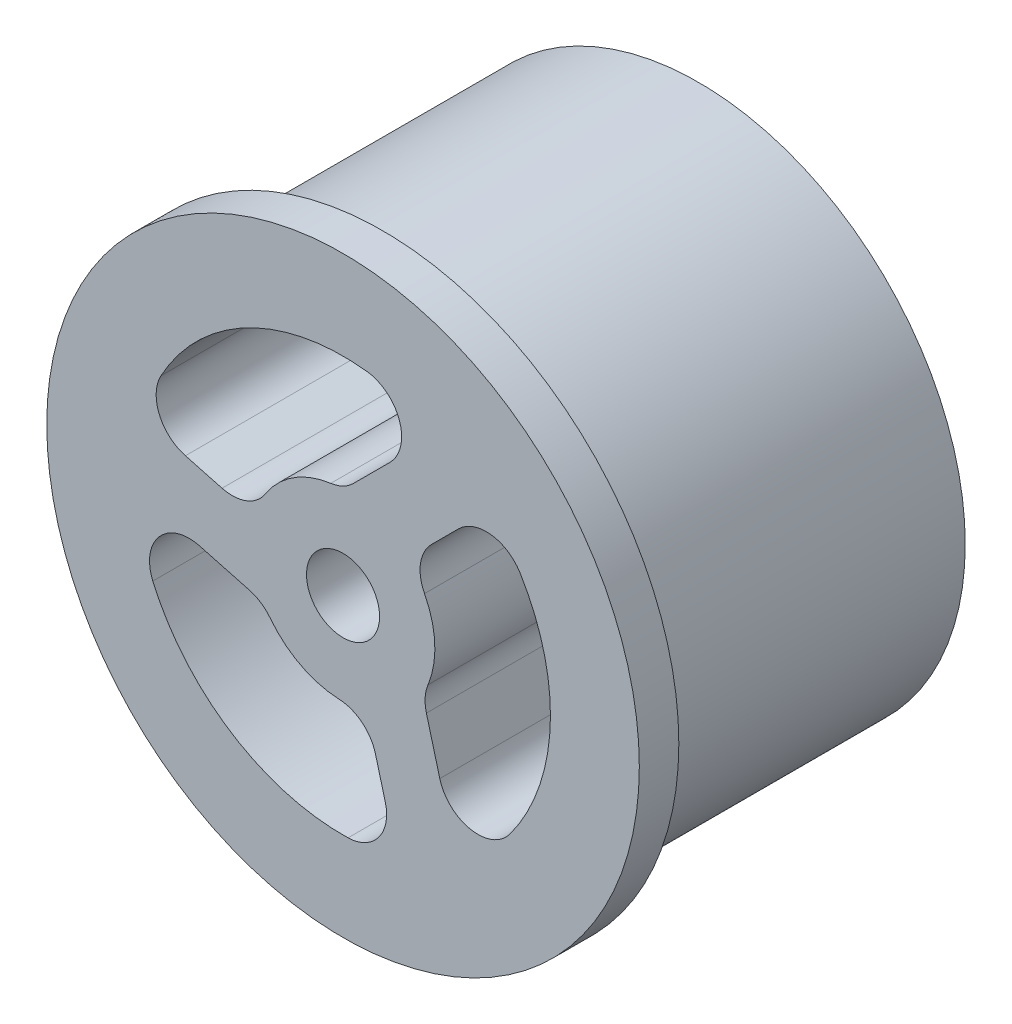
ISO-10303-21;
HEADER;
FILE_DESCRIPTION(('STEP AP214'),'2;1');
FILE_NAME('part.step','',(''),(''),'','','');
FILE_SCHEMA(('AUTOMOTIVE_DESIGN { 1 0 10303 214 1 1 1 1 }'));
ENDSEC;
DATA;
#1=APPLICATION_CONTEXT('core data for automotive mechanical design processes');
#2=APPLICATION_PROTOCOL_DEFINITION('international standard','automotive_design',2000,#1);
#3=PRODUCT_CONTEXT('',#1,'mechanical');
#4=PRODUCT('Part','Part','',(#3));
#5=PRODUCT_RELATED_PRODUCT_CATEGORY('part','',(#4));
#6=PRODUCT_DEFINITION_FORMATION('','',#4);
#7=PRODUCT_DEFINITION_CONTEXT('part definition',#1,'design');
#8=PRODUCT_DEFINITION('design','',#6,#7);
#9=PRODUCT_DEFINITION_SHAPE('','',#8);
#10=(LENGTH_UNIT() NAMED_UNIT(*) SI_UNIT(.MILLI.,.METRE.));
#11=(NAMED_UNIT(*) PLANE_ANGLE_UNIT() SI_UNIT($,.RADIAN.));
#12=(NAMED_UNIT(*) SI_UNIT($,.STERADIAN.) SOLID_ANGLE_UNIT());
#13=UNCERTAINTY_MEASURE_WITH_UNIT(LENGTH_MEASURE(1.E-05),#10,'distance_accuracy_value','');
#14=(GEOMETRIC_REPRESENTATION_CONTEXT(3) GLOBAL_UNCERTAINTY_ASSIGNED_CONTEXT((#13)) GLOBAL_UNIT_ASSIGNED_CONTEXT((#10,
#11,#12)) REPRESENTATION_CONTEXT('',''));
#15=CARTESIAN_POINT('',(0.,0.,0.));
#16=DIRECTION('',(0.,0.,1.));
#17=DIRECTION('',(1.,0.,0.));
#18=AXIS2_PLACEMENT_3D('',#15,#16,#17);
#19=CARTESIAN_POINT('',(0.,0.,9.));
#20=DIRECTION('',(0.,0.,-1.));
#21=DIRECTION('',(-1.,0.,0.));
#22=AXIS2_PLACEMENT_3D('',#19,#20,#21);
#23=CYLINDRICAL_SURFACE('',#22,6.75);
#24=CARTESIAN_POINT('',(0.,0.,0.));
#25=DIRECTION('',(0.,0.,1.));
#26=DIRECTION('',(1.,0.,0.));
#27=AXIS2_PLACEMENT_3D('',#24,#25,#26);
#28=CIRCLE('',#27,6.75);
#29=CARTESIAN_POINT('',(6.75,0.,0.));
#30=VERTEX_POINT('',#29);
#31=EDGE_CURVE('E235',#30,#30,#28,.T.);
#32=ORIENTED_EDGE('',*,*,#31,.T.);
#33=EDGE_LOOP('',(#32));
#34=FACE_BOUND('',#33,.T.);
#35=CARTESIAN_POINT('',(0.,0.,8.));
#36=DIRECTION('',(0.,0.,1.));
#37=DIRECTION('',(1.,0.,0.));
#38=AXIS2_PLACEMENT_3D('',#35,#36,#37);
#39=CIRCLE('',#38,6.75);
#40=CARTESIAN_POINT('',(6.75,0.,8.));
#41=VERTEX_POINT('',#40);
#42=EDGE_CURVE('E355',#41,#41,#39,.T.);
#43=ORIENTED_EDGE('',*,*,#42,.F.);
#44=EDGE_LOOP('',(#43));
#45=FACE_BOUND('',#44,.T.);
#46=ADVANCED_FACE('F47',(#34,#45),#23,.T.);
#47=CARTESIAN_POINT('',(0.,0.,9.));
#48=DIRECTION('',(0.,0.,-1.));
#49=DIRECTION('',(-1.,0.,0.));
#50=AXIS2_PLACEMENT_3D('',#47,#48,#49);
#51=CYLINDRICAL_SURFACE('',#50,5.25);
#52=CARTESIAN_POINT('',(0.,0.,0.));
#53=DIRECTION('',(0.,0.,1.));
#54=DIRECTION('',(1.,0.,0.));
#55=AXIS2_PLACEMENT_3D('',#52,#53,#54);
#56=CIRCLE('',#55,5.25);
#57=CARTESIAN_POINT('',(-4.81561186095118,-2.0910242477471,0.));
#58=VERTEX_POINT('',#57);
#59=CARTESIAN_POINT('',(0.127448118152494,-5.2484528174672,0.));
#60=VERTEX_POINT('',#59);
#61=EDGE_CURVE('E398',#58,#60,#56,.T.);
#62=ORIENTED_EDGE('',*,*,#61,.F.);
#63=DIRECTION('',(0.,0.,-1.));
#64=VECTOR('',#63,1.);
#65=CARTESIAN_POINT('',(-4.81561186095118,-2.0910242477471,9.));
#66=LINE('',#65,#64);
#67=CARTESIAN_POINT('',(-4.81561186095118,-2.0910242477471,9.));
#68=VERTEX_POINT('',#67);
#69=EDGE_CURVE('E366',#58,#68,#66,.F.);
#70=ORIENTED_EDGE('',*,*,#69,.T.);
#71=CARTESIAN_POINT('',(0.,0.,9.));
#72=DIRECTION('',(0.,0.,1.));
#73=DIRECTION('',(1.,0.,0.));
#74=AXIS2_PLACEMENT_3D('',#71,#72,#73);
#75=CIRCLE('',#74,5.25);
#76=CARTESIAN_POINT('',(0.127448118152494,-5.2484528174672,9.));
#77=VERTEX_POINT('',#76);
#78=EDGE_CURVE('E417',#68,#77,#75,.T.);
#79=ORIENTED_EDGE('',*,*,#78,.T.);
#80=DIRECTION('',(0.,0.,-1.));
#81=VECTOR('',#80,1.);
#82=CARTESIAN_POINT('',(0.127448118152494,-5.2484528174672,9.));
#83=LINE('',#82,#81);
#84=EDGE_CURVE('E295',#77,#60,#83,.T.);
#85=ORIENTED_EDGE('',*,*,#84,.T.);
#86=EDGE_LOOP('',(#62,#70,#79,#85));
#87=FACE_BOUND('',#86,.T.);
#88=ADVANCED_FACE('F405',(#87),#51,.F.);
#89=CARTESIAN_POINT('',(0.59692581199734,5.21595433022293,0.));
#90=VERTEX_POINT('',#89);
#91=CARTESIAN_POINT('',(-4.60901752956685,2.51385310074903,0.));
#92=VERTEX_POINT('',#91);
#93=EDGE_CURVE('E410',#90,#92,#56,.T.);
#94=ORIENTED_EDGE('',*,*,#93,.F.);
#95=DIRECTION('',(0.,0.,-1.));
#96=VECTOR('',#95,1.);
#97=CARTESIAN_POINT('',(0.59692581199734,5.21595433022293,9.));
#98=LINE('',#97,#96);
#99=CARTESIAN_POINT('',(0.59692581199734,5.21595433022293,9.));
#100=VERTEX_POINT('',#99);
#101=EDGE_CURVE('E359',#90,#100,#98,.F.);
#102=ORIENTED_EDGE('',*,*,#101,.T.);
#103=CARTESIAN_POINT('',(-4.60901752956685,2.51385310074903,9.));
#104=VERTEX_POINT('',#103);
#105=EDGE_CURVE('E242',#100,#104,#75,.T.);
#106=ORIENTED_EDGE('',*,*,#105,.T.);
#107=DIRECTION('',(0.,0.,-1.));
#108=VECTOR('',#107,1.);
#109=CARTESIAN_POINT('',(-4.60901752956685,2.51385310074903,9.));
#110=LINE('',#109,#108);
#111=EDGE_CURVE('E299',#104,#92,#110,.T.);
#112=ORIENTED_EDGE('',*,*,#111,.T.);
#113=EDGE_LOOP('',(#94,#102,#106,#112));
#114=FACE_BOUND('',#113,.T.);
#115=ADVANCED_FACE('F456',(#114),#51,.F.);
#116=CARTESIAN_POINT('',(4.21868604895386,-3.12493008247577,0.));
#117=VERTEX_POINT('',#116);
#118=CARTESIAN_POINT('',(4.48156941141436,2.73459971671818,0.));
#119=VERTEX_POINT('',#118);
#120=EDGE_CURVE('E411',#117,#119,#56,.T.);
#121=ORIENTED_EDGE('',*,*,#120,.F.);
#122=DIRECTION('',(0.,0.,-1.));
#123=VECTOR('',#122,1.);
#124=CARTESIAN_POINT('',(4.21868604895386,-3.12493008247577,9.));
#125=LINE('',#124,#123);
#126=CARTESIAN_POINT('',(4.21868604895386,-3.12493008247577,9.));
#127=VERTEX_POINT('',#126);
#128=EDGE_CURVE('E373',#117,#127,#125,.F.);
#129=ORIENTED_EDGE('',*,*,#128,.T.);
#130=CARTESIAN_POINT('',(4.48156941141436,2.73459971671818,9.));
#131=VERTEX_POINT('',#130);
#132=EDGE_CURVE('E435',#127,#131,#75,.T.);
#133=ORIENTED_EDGE('',*,*,#132,.T.);
#134=DIRECTION('',(0.,0.,-1.));
#135=VECTOR('',#134,1.);
#136=CARTESIAN_POINT('',(4.48156941141436,2.73459971671818,9.));
#137=LINE('',#136,#135);
#138=EDGE_CURVE('E291',#131,#119,#137,.T.);
#139=ORIENTED_EDGE('',*,*,#138,.T.);
#140=EDGE_LOOP('',(#121,#129,#133,#139));
#141=FACE_BOUND('',#140,.T.);
#142=ADVANCED_FACE('F552',(#141),#51,.F.);
#143=CARTESIAN_POINT('',(0.,0.,9.));
#144=DIRECTION('',(0.,0.,1.));
#145=DIRECTION('',(1.,0.,0.));
#146=AXIS2_PLACEMENT_3D('',#143,#144,#145);
#147=PLANE('',#146);
#148=ORIENTED_EDGE('',*,*,#105,.F.);
#149=CARTESIAN_POINT('',(0.48322565733118,4.22243921970428,9.));
#150=DIRECTION('',(0.,0.,1.));
#151=DIRECTION('',(1.,0.,0.));
#152=AXIS2_PLACEMENT_3D('',#149,#150,#151);
#153=CIRCLE('',#152,1.);
#154=CARTESIAN_POINT('',(1.19033243851773,3.51533243851773,9.));
#155=VERTEX_POINT('',#154);
#156=EDGE_CURVE('E379',#100,#155,#153,.F.);
#157=ORIENTED_EDGE('',*,*,#156,.T.);
#158=DIRECTION('',(0.707106781186548,0.707106781186547,0.));
#159=VECTOR('',#158,1.);
#160=CARTESIAN_POINT('',(-1.1625,1.1625,9.));
#161=LINE('',#160,#159);
#162=CARTESIAN_POINT('',(0.263116702953945,2.58811670295394,9.));
#163=VERTEX_POINT('',#162);
#164=EDGE_CURVE('E505',#163,#155,#161,.T.);
#165=ORIENTED_EDGE('',*,*,#164,.F.);
#166=CARTESIAN_POINT('',(-0.443990078232603,3.29522348414049,9.));
#167=DIRECTION('',(0.,0.,1.));
#168=DIRECTION('',(1.,0.,0.));
#169=AXIS2_PLACEMENT_3D('',#166,#167,#168);
#170=CIRCLE('',#169,1.);
#171=CARTESIAN_POINT('',(-0.310459227636331,2.30417882725613,9.));
#172=VERTEX_POINT('',#171);
#173=EDGE_CURVE('E309',#163,#172,#170,.F.);
#174=ORIENTED_EDGE('',*,*,#173,.T.);
#175=CARTESIAN_POINT('',(0.,0.,9.));
#176=DIRECTION('',(0.,0.,1.));
#177=DIRECTION('',(1.,0.,0.));
#178=AXIS2_PLACEMENT_3D('',#175,#176,#177);
#179=CIRCLE('',#178,2.325);
#180=CARTESIAN_POINT('',(-1.96082475084321,1.24931633163129,9.));
#181=VERTEX_POINT('',#180);
#182=EDGE_CURVE('E431',#172,#181,#179,.T.);
#183=ORIENTED_EDGE('',*,*,#182,.T.);
#184=CARTESIAN_POINT('',(-2.80419023507685,1.78665668932217,9.));
#185=DIRECTION('',(0.,0.,1.));
#186=DIRECTION('',(1.,0.,0.));
#187=AXIS2_PLACEMENT_3D('',#184,#185,#186);
#188=CIRCLE('',#187,1.);
#189=CARTESIAN_POINT('',(-3.06300928017937,0.820730863033104,9.));
#190=VERTEX_POINT('',#189);
#191=EDGE_CURVE('E315',#181,#190,#188,.F.);
#192=ORIENTED_EDGE('',*,*,#191,.T.);
#193=DIRECTION('',(-0.965925826289068,0.258819045102523,0.));
#194=VECTOR('',#193,1.);
#195=CARTESIAN_POINT('',(0.,0.,9.));
#196=LINE('',#195,#194);
#197=CARTESIAN_POINT('',(-3.9899284737995,1.06909811241253,9.));
#198=VERTEX_POINT('',#197);
#199=EDGE_CURVE('E423',#190,#198,#196,.T.);
#200=ORIENTED_EDGE('',*,*,#199,.T.);
#201=CARTESIAN_POINT('',(-3.73110942869697,2.03502393870159,9.));
#202=DIRECTION('',(0.,0.,1.));
#203=DIRECTION('',(1.,0.,0.));
#204=AXIS2_PLACEMENT_3D('',#201,#202,#203);
#205=CIRCLE('',#204,1.);
#206=EDGE_CURVE('E348',#198,#104,#205,.F.);
#207=ORIENTED_EDGE('',*,*,#206,.T.);
#208=EDGE_LOOP('',(#148,#157,#165,#174,#183,#192,#200,#207));
#209=FACE_BOUND('',#208,.T.);
#210=CARTESIAN_POINT('',(0.,0.,9.));
#211=DIRECTION('',(0.,0.,1.));
#212=DIRECTION('',(1.,0.,0.));
#213=AXIS2_PLACEMENT_3D('',#210,#211,#212);
#214=CIRCLE('',#213,2.325);
#215=CARTESIAN_POINT('',(2.15070701308423,-0.883223835655674,9.));
#216=VERTEX_POINT('',#215);
#217=CARTESIAN_POINT('',(2.06235205597709,1.07346588078387,9.));
#218=VERTEX_POINT('',#217);
#219=EDGE_CURVE('E211',#216,#218,#214,.T.);
#220=ORIENTED_EDGE('',*,*,#219,.T.);
#221=CARTESIAN_POINT('',(2.94938519833282,1.53517163595973,9.));
#222=DIRECTION('',(0.,0.,1.));
#223=DIRECTION('',(1.,0.,0.));
#224=AXIS2_PLACEMENT_3D('',#221,#222,#223);
#225=CIRCLE('',#224,1.);
#226=CARTESIAN_POINT('',(2.24227841714627,2.24227841714627,9.));
#227=VERTEX_POINT('',#226);
#228=EDGE_CURVE('E303',#218,#227,#225,.F.);
#229=ORIENTED_EDGE('',*,*,#228,.T.);
#230=DIRECTION('',(0.707106781186548,0.707106781186548,0.));
#231=VECTOR('',#230,1.);
#232=CARTESIAN_POINT('',(0.,0.,9.));
#233=LINE('',#232,#231);
#234=CARTESIAN_POINT('',(2.92083036138698,2.92083036138698,9.));
#235=VERTEX_POINT('',#234);
#236=EDGE_CURVE('E230',#227,#235,#233,.T.);
#237=ORIENTED_EDGE('',*,*,#236,.T.);
#238=CARTESIAN_POINT('',(3.62793714257353,2.21372358020043,9.));
#239=DIRECTION('',(0.,0.,1.));
#240=DIRECTION('',(1.,0.,0.));
#241=AXIS2_PLACEMENT_3D('',#238,#239,#240);
#242=CIRCLE('',#241,1.);
#243=EDGE_CURVE('E334',#235,#131,#242,.F.);
#244=ORIENTED_EDGE('',*,*,#243,.T.);
#245=ORIENTED_EDGE('',*,*,#132,.F.);
#246=CARTESIAN_POINT('',(3.41512680153408,-2.52970530486134,9.));
#247=DIRECTION('',(0.,0.,1.));
#248=DIRECTION('',(1.,0.,0.));
#249=AXIS2_PLACEMENT_3D('',#246,#247,#248);
#250=CIRCLE('',#249,1.);
#251=CARTESIAN_POINT('',(2.44920097524501,-2.78852434996386,9.));
#252=VERTEX_POINT('',#251);
#253=EDGE_CURVE('E56',#127,#252,#250,.F.);
#254=ORIENTED_EDGE('',*,*,#253,.T.);
#255=DIRECTION('',(0.258819045102521,-0.965925826289068,0.));
#256=VECTOR('',#255,1.);
#257=CARTESIAN_POINT('',(1.58800453189944,0.425504531899419,9.));
#258=LINE('',#257,#256);
#259=CARTESIAN_POINT('',(2.10981646123999,-1.52192410039504,9.));
#260=VERTEX_POINT('',#259);
#261=EDGE_CURVE('E212',#260,#252,#258,.T.);
#262=ORIENTED_EDGE('',*,*,#261,.F.);
#263=CARTESIAN_POINT('',(3.07574228752906,-1.26310505529252,9.));
#264=DIRECTION('',(0.,0.,1.));
#265=DIRECTION('',(1.,0.,0.));
#266=AXIS2_PLACEMENT_3D('',#263,#264,#265);
#267=CIRCLE('',#266,1.);
#268=EDGE_CURVE('E207',#260,#216,#267,.F.);
#269=ORIENTED_EDGE('',*,*,#268,.T.);
#270=EDGE_LOOP('',(#220,#229,#237,#244,#245,#254,#262,#269));
#271=FACE_BOUND('',#270,.T.);
#272=ORIENTED_EDGE('',*,*,#78,.F.);
#273=CARTESIAN_POINT('',(-3.89835245886524,-1.69273391484289,9.));
#274=DIRECTION('',(0.,0.,1.));
#275=DIRECTION('',(1.,0.,0.));
#276=AXIS2_PLACEMENT_3D('',#273,#274,#275);
#277=CIRCLE('',#276,1.);
#278=CARTESIAN_POINT('',(-3.63953341376272,-0.726808088553821,9.));
#279=VERTEX_POINT('',#278);
#280=EDGE_CURVE('E385',#68,#279,#277,.F.);
#281=ORIENTED_EDGE('',*,*,#280,.T.);
#282=DIRECTION('',(-0.965925826289068,0.258819045102521,0.));
#283=VECTOR('',#282,1.);
#284=CARTESIAN_POINT('',(-0.425504531899407,-1.5880045318994,9.));
#285=LINE('',#284,#283);
#286=CARTESIAN_POINT('',(-2.37293316419392,-1.06619260255884,9.));
#287=VERTEX_POINT('',#286);
#288=EDGE_CURVE('E416',#287,#279,#285,.T.);
#289=ORIENTED_EDGE('',*,*,#288,.F.);
#290=CARTESIAN_POINT('',(-2.63175220929645,-2.03211842884791,9.));
#291=DIRECTION('',(0.,0.,1.));
#292=DIRECTION('',(1.,0.,0.));
#293=AXIS2_PLACEMENT_3D('',#290,#291,#292);
#294=CIRCLE('',#293,1.);
#295=CARTESIAN_POINT('',(-1.84024778544789,-1.42095499160042,9.));
#296=VERTEX_POINT('',#295);
#297=EDGE_CURVE('E321',#287,#296,#294,.F.);
#298=ORIENTED_EDGE('',*,*,#297,.T.);
#299=CARTESIAN_POINT('',(0.,0.,9.));
#300=DIRECTION('',(0.,0.,1.));
#301=DIRECTION('',(1.,0.,0.));
#302=AXIS2_PLACEMENT_3D('',#299,#300,#301);
#303=CIRCLE('',#302,2.325);
#304=CARTESIAN_POINT('',(-0.101527305133866,-2.32278221241516,9.));
#305=VERTEX_POINT('',#304);
#306=EDGE_CURVE('E491',#296,#305,#303,.T.);
#307=ORIENTED_EDGE('',*,*,#306,.T.);
#308=CARTESIAN_POINT('',(-0.145194963255959,-3.32182832528189,9.));
#309=DIRECTION('',(0.,0.,1.));
#310=DIRECTION('',(1.,0.,0.));
#311=AXIS2_PLACEMENT_3D('',#308,#309,#310);
#312=CIRCLE('',#311,1.);
#313=CARTESIAN_POINT('',(0.820730863033112,-3.06300928017938,9.));
#314=VERTEX_POINT('',#313);
#315=EDGE_CURVE('E327',#305,#314,#312,.F.);
#316=ORIENTED_EDGE('',*,*,#315,.T.);
#317=DIRECTION('',(0.258819045102507,-0.965925826289072,0.));
#318=VECTOR('',#317,1.);
#319=CARTESIAN_POINT('',(0.,0.,9.));
#320=LINE('',#319,#318);
#321=CARTESIAN_POINT('',(1.06909811241252,-3.98992847379951,9.));
#322=VERTEX_POINT('',#321);
#323=EDGE_CURVE('E495',#314,#322,#320,.T.);
#324=ORIENTED_EDGE('',*,*,#323,.T.);
#325=CARTESIAN_POINT('',(0.103172286123447,-4.24874751890202,9.));
#326=DIRECTION('',(0.,0.,1.));
#327=DIRECTION('',(1.,0.,0.));
#328=AXIS2_PLACEMENT_3D('',#325,#326,#327);
#329=CIRCLE('',#328,1.);
#330=EDGE_CURVE('E341',#322,#77,#329,.F.);
#331=ORIENTED_EDGE('',*,*,#330,.T.);
#332=EDGE_LOOP('',(#272,#281,#289,#298,#307,#316,#324,#331));
#333=FACE_BOUND('',#332,.T.);
#334=CARTESIAN_POINT('',(0.,0.,9.));
#335=DIRECTION('',(0.,0.,1.));
#336=DIRECTION('',(1.,0.,0.));
#337=AXIS2_PLACEMENT_3D('',#334,#335,#336);
#338=CIRCLE('',#337,0.925);
#339=CARTESIAN_POINT('',(0.925,0.,9.));
#340=VERTEX_POINT('',#339);
#341=EDGE_CURVE('E422',#340,#340,#338,.T.);
#342=ORIENTED_EDGE('',*,*,#341,.F.);
#343=EDGE_LOOP('',(#342));
#344=FACE_BOUND('',#343,.T.);
#345=CARTESIAN_POINT('',(0.,0.,9.));
#346=DIRECTION('',(0.,0.,1.));
#347=DIRECTION('',(1.,0.,0.));
#348=AXIS2_PLACEMENT_3D('',#345,#346,#347);
#349=CIRCLE('',#348,7.5);
#350=CARTESIAN_POINT('',(7.5,0.,9.));
#351=VERTEX_POINT('',#350);
#352=EDGE_CURVE('E512',#351,#351,#349,.T.);
#353=ORIENTED_EDGE('',*,*,#352,.T.);
#354=EDGE_LOOP('',(#353));
#355=FACE_BOUND('',#354,.T.);
#356=ADVANCED_FACE('F209',(#209,#271,#333,#344,#355),#147,.T.);
#357=CARTESIAN_POINT('',(0.,0.,0.));
#358=DIRECTION('',(0.,0.,1.));
#359=DIRECTION('',(1.,0.,0.));
#360=AXIS2_PLACEMENT_3D('',#357,#358,#359);
#361=PLANE('',#360);
#362=CARTESIAN_POINT('',(0.,0.,0.));
#363=DIRECTION('',(0.,0.,1.));
#364=DIRECTION('',(1.,0.,0.));
#365=AXIS2_PLACEMENT_3D('',#362,#363,#364);
#366=CIRCLE('',#365,2.325);
#367=CARTESIAN_POINT('',(-0.310459227636331,2.30417882725613,0.));
#368=VERTEX_POINT('',#367);
#369=CARTESIAN_POINT('',(-1.96082475084321,1.24931633163129,0.));
#370=VERTEX_POINT('',#369);
#371=EDGE_CURVE('E477',#368,#370,#366,.T.);
#372=ORIENTED_EDGE('',*,*,#371,.F.);
#373=CARTESIAN_POINT('',(-0.443990078232603,3.29522348414049,0.));
#374=DIRECTION('',(0.,0.,1.));
#375=DIRECTION('',(1.,0.,0.));
#376=AXIS2_PLACEMENT_3D('',#373,#374,#375);
#377=CIRCLE('',#376,1.);
#378=CARTESIAN_POINT('',(0.263116702953945,2.58811670295394,0.));
#379=VERTEX_POINT('',#378);
#380=EDGE_CURVE('E312',#368,#379,#377,.T.);
#381=ORIENTED_EDGE('',*,*,#380,.T.);
#382=DIRECTION('',(0.707106781186548,0.707106781186547,0.));
#383=VECTOR('',#382,1.);
#384=CARTESIAN_POINT('',(-1.1625,1.1625,0.));
#385=LINE('',#384,#383);
#386=CARTESIAN_POINT('',(1.19033243851773,3.51533243851773,0.));
#387=VERTEX_POINT('',#386);
#388=EDGE_CURVE('E480',#379,#387,#385,.T.);
#389=ORIENTED_EDGE('',*,*,#388,.T.);
#390=CARTESIAN_POINT('',(0.48322565733118,4.22243921970428,0.));
#391=DIRECTION('',(0.,0.,1.));
#392=DIRECTION('',(1.,0.,0.));
#393=AXIS2_PLACEMENT_3D('',#390,#391,#392);
#394=CIRCLE('',#393,1.);
#395=EDGE_CURVE('E382',#387,#90,#394,.T.);
#396=ORIENTED_EDGE('',*,*,#395,.T.);
#397=ORIENTED_EDGE('',*,*,#93,.T.);
#398=CARTESIAN_POINT('',(-3.73110942869697,2.03502393870159,0.));
#399=DIRECTION('',(0.,0.,1.));
#400=DIRECTION('',(1.,0.,0.));
#401=AXIS2_PLACEMENT_3D('',#398,#399,#400);
#402=CIRCLE('',#401,1.);
#403=CARTESIAN_POINT('',(-3.9899284737995,1.06909811241253,0.));
#404=VERTEX_POINT('',#403);
#405=EDGE_CURVE('E352',#92,#404,#402,.T.);
#406=ORIENTED_EDGE('',*,*,#405,.T.);
#407=DIRECTION('',(-0.965925826289068,0.258819045102523,0.));
#408=VECTOR('',#407,1.);
#409=CARTESIAN_POINT('',(0.,0.,0.));
#410=LINE('',#409,#408);
#411=CARTESIAN_POINT('',(-3.06300928017937,0.820730863033104,0.));
#412=VERTEX_POINT('',#411);
#413=EDGE_CURVE('E465',#412,#404,#410,.T.);
#414=ORIENTED_EDGE('',*,*,#413,.F.);
#415=CARTESIAN_POINT('',(-2.80419023507685,1.78665668932217,0.));
#416=DIRECTION('',(0.,0.,1.));
#417=DIRECTION('',(1.,0.,0.));
#418=AXIS2_PLACEMENT_3D('',#415,#416,#417);
#419=CIRCLE('',#418,1.);
#420=EDGE_CURVE('E318',#412,#370,#419,.T.);
#421=ORIENTED_EDGE('',*,*,#420,.T.);
#422=EDGE_LOOP('',(#372,#381,#389,#396,#397,#406,#414,#421));
#423=FACE_BOUND('',#422,.T.);
#424=DIRECTION('',(0.258819045102521,-0.965925826289068,0.));
#425=VECTOR('',#424,1.);
#426=CARTESIAN_POINT('',(1.58800453189944,0.425504531899419,0.));
#427=LINE('',#426,#425);
#428=CARTESIAN_POINT('',(2.10981646123999,-1.52192410039504,0.));
#429=VERTEX_POINT('',#428);
#430=CARTESIAN_POINT('',(2.44920097524501,-2.78852434996386,0.));
#431=VERTEX_POINT('',#430);
#432=EDGE_CURVE('E526',#429,#431,#427,.T.);
#433=ORIENTED_EDGE('',*,*,#432,.T.);
#434=CARTESIAN_POINT('',(3.41512680153408,-2.52970530486134,0.));
#435=DIRECTION('',(0.,0.,1.));
#436=DIRECTION('',(1.,0.,0.));
#437=AXIS2_PLACEMENT_3D('',#434,#435,#436);
#438=CIRCLE('',#437,1.);
#439=EDGE_CURVE('E11',#431,#117,#438,.T.);
#440=ORIENTED_EDGE('',*,*,#439,.T.);
#441=ORIENTED_EDGE('',*,*,#120,.T.);
#442=CARTESIAN_POINT('',(3.62793714257353,2.21372358020043,0.));
#443=DIRECTION('',(0.,0.,1.));
#444=DIRECTION('',(1.,0.,0.));
#445=AXIS2_PLACEMENT_3D('',#442,#443,#444);
#446=CIRCLE('',#445,1.);
#447=CARTESIAN_POINT('',(2.92083036138698,2.92083036138698,0.));
#448=VERTEX_POINT('',#447);
#449=EDGE_CURVE('E338',#119,#448,#446,.T.);
#450=ORIENTED_EDGE('',*,*,#449,.T.);
#451=DIRECTION('',(0.707106781186548,0.707106781186548,0.));
#452=VECTOR('',#451,1.);
#453=CARTESIAN_POINT('',(0.,0.,0.));
#454=LINE('',#453,#452);
#455=CARTESIAN_POINT('',(2.24227841714627,2.24227841714627,0.));
#456=VERTEX_POINT('',#455);
#457=EDGE_CURVE('E485',#456,#448,#454,.T.);
#458=ORIENTED_EDGE('',*,*,#457,.F.);
#459=CARTESIAN_POINT('',(2.94938519833282,1.53517163595973,0.));
#460=DIRECTION('',(0.,0.,1.));
#461=DIRECTION('',(1.,0.,0.));
#462=AXIS2_PLACEMENT_3D('',#459,#460,#461);
#463=CIRCLE('',#462,1.);
#464=CARTESIAN_POINT('',(2.06235205597709,1.07346588078387,0.));
#465=VERTEX_POINT('',#464);
#466=EDGE_CURVE('E306',#456,#465,#463,.T.);
#467=ORIENTED_EDGE('',*,*,#466,.T.);
#468=CARTESIAN_POINT('',(0.,0.,0.));
#469=DIRECTION('',(0.,0.,1.));
#470=DIRECTION('',(1.,0.,0.));
#471=AXIS2_PLACEMENT_3D('',#468,#469,#470);
#472=CIRCLE('',#471,2.325);
#473=CARTESIAN_POINT('',(2.15070701308423,-0.883223835655674,0.));
#474=VERTEX_POINT('',#473);
#475=EDGE_CURVE('E529',#474,#465,#472,.T.);
#476=ORIENTED_EDGE('',*,*,#475,.F.);
#477=CARTESIAN_POINT('',(3.07574228752906,-1.26310505529252,0.));
#478=DIRECTION('',(0.,0.,1.));
#479=DIRECTION('',(1.,0.,0.));
#480=AXIS2_PLACEMENT_3D('',#477,#478,#479);
#481=CIRCLE('',#480,1.);
#482=EDGE_CURVE('E218',#474,#429,#481,.T.);
#483=ORIENTED_EDGE('',*,*,#482,.T.);
#484=EDGE_LOOP('',(#433,#440,#441,#450,#458,#467,#476,#483));
#485=FACE_BOUND('',#484,.T.);
#486=ORIENTED_EDGE('',*,*,#31,.F.);
#487=EDGE_LOOP('',(#486));
#488=FACE_BOUND('',#487,.T.);
#489=CARTESIAN_POINT('',(0.,0.,0.));
#490=DIRECTION('',(0.,0.,1.));
#491=DIRECTION('',(1.,0.,0.));
#492=AXIS2_PLACEMENT_3D('',#489,#490,#491);
#493=CIRCLE('',#492,2.325);
#494=CARTESIAN_POINT('',(-1.84024778544789,-1.42095499160042,0.));
#495=VERTEX_POINT('',#494);
#496=CARTESIAN_POINT('',(-0.101527305133866,-2.32278221241516,0.));
#497=VERTEX_POINT('',#496);
#498=EDGE_CURVE('E428',#495,#497,#493,.T.);
#499=ORIENTED_EDGE('',*,*,#498,.F.);
#500=CARTESIAN_POINT('',(-2.63175220929645,-2.03211842884791,0.));
#501=DIRECTION('',(0.,0.,1.));
#502=DIRECTION('',(1.,0.,0.));
#503=AXIS2_PLACEMENT_3D('',#500,#501,#502);
#504=CIRCLE('',#503,1.);
#505=CARTESIAN_POINT('',(-2.37293316419392,-1.06619260255884,0.));
#506=VERTEX_POINT('',#505);
#507=EDGE_CURVE('E324',#495,#506,#504,.T.);
#508=ORIENTED_EDGE('',*,*,#507,.T.);
#509=DIRECTION('',(-0.965925826289068,0.258819045102521,0.));
#510=VECTOR('',#509,1.);
#511=CARTESIAN_POINT('',(-0.425504531899407,-1.5880045318994,0.));
#512=LINE('',#511,#510);
#513=CARTESIAN_POINT('',(-3.63953341376272,-0.726808088553821,0.));
#514=VERTEX_POINT('',#513);
#515=EDGE_CURVE('E400',#506,#514,#512,.T.);
#516=ORIENTED_EDGE('',*,*,#515,.T.);
#517=CARTESIAN_POINT('',(-3.89835245886524,-1.69273391484289,0.));
#518=DIRECTION('',(0.,0.,1.));
#519=DIRECTION('',(1.,0.,0.));
#520=AXIS2_PLACEMENT_3D('',#517,#518,#519);
#521=CIRCLE('',#520,1.);
#522=EDGE_CURVE('E388',#514,#58,#521,.T.);
#523=ORIENTED_EDGE('',*,*,#522,.T.);
#524=ORIENTED_EDGE('',*,*,#61,.T.);
#525=CARTESIAN_POINT('',(0.103172286123447,-4.24874751890202,0.));
#526=DIRECTION('',(0.,0.,1.));
#527=DIRECTION('',(1.,0.,0.));
#528=AXIS2_PLACEMENT_3D('',#525,#526,#527);
#529=CIRCLE('',#528,1.);
#530=CARTESIAN_POINT('',(1.06909811241252,-3.98992847379951,0.));
#531=VERTEX_POINT('',#530);
#532=EDGE_CURVE('E345',#60,#531,#529,.T.);
#533=ORIENTED_EDGE('',*,*,#532,.T.);
#534=DIRECTION('',(0.258819045102507,-0.965925826289072,0.));
#535=VECTOR('',#534,1.);
#536=CARTESIAN_POINT('',(0.,0.,0.));
#537=LINE('',#536,#535);
#538=CARTESIAN_POINT('',(0.820730863033112,-3.06300928017938,0.));
#539=VERTEX_POINT('',#538);
#540=EDGE_CURVE('E522',#539,#531,#537,.T.);
#541=ORIENTED_EDGE('',*,*,#540,.F.);
#542=CARTESIAN_POINT('',(-0.145194963255959,-3.32182832528189,0.));
#543=DIRECTION('',(0.,0.,1.));
#544=DIRECTION('',(1.,0.,0.));
#545=AXIS2_PLACEMENT_3D('',#542,#543,#544);
#546=CIRCLE('',#545,1.);
#547=EDGE_CURVE('E219',#539,#497,#546,.T.);
#548=ORIENTED_EDGE('',*,*,#547,.T.);
#549=EDGE_LOOP('',(#499,#508,#516,#523,#524,#533,#541,#548));
#550=FACE_BOUND('',#549,.T.);
#551=CARTESIAN_POINT('',(0.,0.,0.));
#552=DIRECTION('',(0.,0.,1.));
#553=DIRECTION('',(1.,0.,0.));
#554=AXIS2_PLACEMENT_3D('',#551,#552,#553);
#555=CIRCLE('',#554,0.925);
#556=CARTESIAN_POINT('',(0.925,0.,0.));
#557=VERTEX_POINT('',#556);
#558=EDGE_CURVE('E438',#557,#557,#555,.T.);
#559=ORIENTED_EDGE('',*,*,#558,.T.);
#560=EDGE_LOOP('',(#559));
#561=FACE_BOUND('',#560,.T.);
#562=ADVANCED_FACE('F396',(#423,#485,#488,#550,#561),#361,.F.);
#563=CARTESIAN_POINT('',(0.,0.,0.));
#564=DIRECTION('',(0.,0.,1.));
#565=DIRECTION('',(1.,0.,0.));
#566=AXIS2_PLACEMENT_3D('',#563,#564,#565);
#567=CYLINDRICAL_SURFACE('',#566,2.325);
#568=ORIENTED_EDGE('',*,*,#306,.F.);
#569=DIRECTION('',(0.,0.,1.));
#570=VECTOR('',#569,1.);
#571=CARTESIAN_POINT('',(-1.84024778544789,-1.42095499160042,0.));
#572=LINE('',#571,#570);
#573=EDGE_CURVE('E278',#296,#495,#572,.F.);
#574=ORIENTED_EDGE('',*,*,#573,.T.);
#575=ORIENTED_EDGE('',*,*,#498,.T.);
#576=DIRECTION('',(0.,0.,1.));
#577=VECTOR('',#576,1.);
#578=CARTESIAN_POINT('',(-0.101527305133866,-2.32278221241516,0.));
#579=LINE('',#578,#577);
#580=EDGE_CURVE('E274',#497,#305,#579,.T.);
#581=ORIENTED_EDGE('',*,*,#580,.T.);
#582=EDGE_LOOP('',(#568,#574,#575,#581));
#583=FACE_BOUND('',#582,.T.);
#584=ADVANCED_FACE('F784',(#583),#567,.T.);
#585=CARTESIAN_POINT('',(-0.425504531899407,-1.5880045318994,0.));
#586=DIRECTION('',(0.258819045102521,0.965925826289068,0.));
#587=DIRECTION('',(-0.965925826289068,0.258819045102521,0.));
#588=AXIS2_PLACEMENT_3D('',#585,#586,#587);
#589=PLANE('',#588);
#590=ORIENTED_EDGE('',*,*,#288,.T.);
#591=DIRECTION('',(0.,0.,-1.));
#592=VECTOR('',#591,1.);
#593=CARTESIAN_POINT('',(-3.63953341376272,-0.726808088553821,0.));
#594=LINE('',#593,#592);
#595=EDGE_CURVE('E370',#279,#514,#594,.T.);
#596=ORIENTED_EDGE('',*,*,#595,.T.);
#597=ORIENTED_EDGE('',*,*,#515,.F.);
#598=DIRECTION('',(0.,0.,1.));
#599=VECTOR('',#598,1.);
#600=CARTESIAN_POINT('',(-2.37293316419392,-1.06619260255884,0.));
#601=LINE('',#600,#599);
#602=EDGE_CURVE('E270',#506,#287,#601,.T.);
#603=ORIENTED_EDGE('',*,*,#602,.T.);
#604=EDGE_LOOP('',(#590,#596,#597,#603));
#605=FACE_BOUND('',#604,.T.);
#606=ADVANCED_FACE('F419',(#605),#589,.F.);
#607=CARTESIAN_POINT('',(0.,0.,0.));
#608=DIRECTION('',(0.258819045102523,0.965925826289068,0.));
#609=DIRECTION('',(-0.965925826289068,0.258819045102523,0.));
#610=AXIS2_PLACEMENT_3D('',#607,#608,#609);
#611=PLANE('',#610);
#612=ORIENTED_EDGE('',*,*,#199,.F.);
#613=DIRECTION('',(0.,0.,-1.));
#614=VECTOR('',#613,1.);
#615=CARTESIAN_POINT('',(-3.06300928017937,0.820730863033104,0.));
#616=LINE('',#615,#614);
#617=EDGE_CURVE('E267',#190,#412,#616,.T.);
#618=ORIENTED_EDGE('',*,*,#617,.T.);
#619=ORIENTED_EDGE('',*,*,#413,.T.);
#620=DIRECTION('',(0.,0.,1.));
#621=VECTOR('',#620,1.);
#622=CARTESIAN_POINT('',(-3.9899284737995,1.06909811241253,9.));
#623=LINE('',#622,#621);
#624=EDGE_CURVE('E263',#404,#198,#623,.T.);
#625=ORIENTED_EDGE('',*,*,#624,.T.);
#626=EDGE_LOOP('',(#612,#618,#619,#625));
#627=FACE_BOUND('',#626,.T.);
#628=ADVANCED_FACE('F463',(#627),#611,.T.);
#629=CARTESIAN_POINT('',(0.,0.,0.));
#630=DIRECTION('',(0.,0.,1.));
#631=DIRECTION('',(1.,0.,0.));
#632=AXIS2_PLACEMENT_3D('',#629,#630,#631);
#633=CYLINDRICAL_SURFACE('',#632,2.325);
#634=ORIENTED_EDGE('',*,*,#182,.F.);
#635=DIRECTION('',(0.,0.,1.));
#636=VECTOR('',#635,1.);
#637=CARTESIAN_POINT('',(-0.310459227636331,2.30417882725613,0.));
#638=LINE('',#637,#636);
#639=EDGE_CURVE('E260',#172,#368,#638,.F.);
#640=ORIENTED_EDGE('',*,*,#639,.T.);
#641=ORIENTED_EDGE('',*,*,#371,.T.);
#642=DIRECTION('',(0.,0.,1.));
#643=VECTOR('',#642,1.);
#644=CARTESIAN_POINT('',(-1.96082475084321,1.24931633163129,0.));
#645=LINE('',#644,#643);
#646=EDGE_CURVE('E256',#370,#181,#645,.T.);
#647=ORIENTED_EDGE('',*,*,#646,.T.);
#648=EDGE_LOOP('',(#634,#640,#641,#647));
#649=FACE_BOUND('',#648,.T.);
#650=ADVANCED_FACE('F475',(#649),#633,.T.);
#651=CARTESIAN_POINT('',(-1.1625,1.1625,0.));
#652=DIRECTION('',(0.707106781186547,-0.707106781186548,0.));
#653=DIRECTION('',(0.707106781186548,0.707106781186547,0.));
#654=AXIS2_PLACEMENT_3D('',#651,#652,#653);
#655=PLANE('',#654);
#656=ORIENTED_EDGE('',*,*,#164,.T.);
#657=DIRECTION('',(0.,0.,-1.));
#658=VECTOR('',#657,1.);
#659=CARTESIAN_POINT('',(1.19033243851773,3.51533243851773,0.));
#660=LINE('',#659,#658);
#661=EDGE_CURVE('E363',#155,#387,#660,.T.);
#662=ORIENTED_EDGE('',*,*,#661,.T.);
#663=ORIENTED_EDGE('',*,*,#388,.F.);
#664=DIRECTION('',(0.,0.,1.));
#665=VECTOR('',#664,1.);
#666=CARTESIAN_POINT('',(0.263116702953945,2.58811670295394,0.));
#667=LINE('',#666,#665);
#668=EDGE_CURVE('E252',#379,#163,#667,.T.);
#669=ORIENTED_EDGE('',*,*,#668,.T.);
#670=EDGE_LOOP('',(#656,#662,#663,#669));
#671=FACE_BOUND('',#670,.T.);
#672=ADVANCED_FACE('F751',(#671),#655,.F.);
#673=CARTESIAN_POINT('',(0.,0.,0.));
#674=DIRECTION('',(0.707106781186547,-0.707106781186547,0.));
#675=DIRECTION('',(0.707106781186548,0.707106781186548,0.));
#676=AXIS2_PLACEMENT_3D('',#673,#674,#675);
#677=PLANE('',#676);
#678=ORIENTED_EDGE('',*,*,#236,.F.);
#679=DIRECTION('',(0.,0.,-1.));
#680=VECTOR('',#679,1.);
#681=CARTESIAN_POINT('',(2.24227841714627,2.24227841714627,0.));
#682=LINE('',#681,#680);
#683=EDGE_CURVE('E249',#227,#456,#682,.T.);
#684=ORIENTED_EDGE('',*,*,#683,.T.);
#685=ORIENTED_EDGE('',*,*,#457,.T.);
#686=DIRECTION('',(0.,0.,1.));
#687=VECTOR('',#686,1.);
#688=CARTESIAN_POINT('',(2.92083036138698,2.92083036138698,9.));
#689=LINE('',#688,#687);
#690=EDGE_CURVE('E239',#448,#235,#689,.T.);
#691=ORIENTED_EDGE('',*,*,#690,.T.);
#692=EDGE_LOOP('',(#678,#684,#685,#691));
#693=FACE_BOUND('',#692,.T.);
#694=ADVANCED_FACE('F537',(#693),#677,.T.);
#695=CARTESIAN_POINT('',(0.,0.,0.));
#696=DIRECTION('',(0.,0.,1.));
#697=DIRECTION('',(1.,0.,0.));
#698=AXIS2_PLACEMENT_3D('',#695,#696,#697);
#699=CYLINDRICAL_SURFACE('',#698,2.325);
#700=ORIENTED_EDGE('',*,*,#475,.T.);
#701=DIRECTION('',(0.,0.,1.));
#702=VECTOR('',#701,1.);
#703=CARTESIAN_POINT('',(2.06235205597709,1.07346588078387,0.));
#704=LINE('',#703,#702);
#705=EDGE_CURVE('E228',#465,#218,#704,.T.);
#706=ORIENTED_EDGE('',*,*,#705,.T.);
#707=ORIENTED_EDGE('',*,*,#219,.F.);
#708=DIRECTION('',(0.,0.,1.));
#709=VECTOR('',#708,1.);
#710=CARTESIAN_POINT('',(2.15070701308423,-0.883223835655673,0.));
#711=LINE('',#710,#709);
#712=EDGE_CURVE('E225',#216,#474,#711,.F.);
#713=ORIENTED_EDGE('',*,*,#712,.T.);
#714=EDGE_LOOP('',(#700,#706,#707,#713));
#715=FACE_BOUND('',#714,.T.);
#716=ADVANCED_FACE('F224',(#715),#699,.T.);
#717=CARTESIAN_POINT('',(1.58800453189944,0.425504531899419,0.));
#718=DIRECTION('',(-0.965925826289068,-0.258819045102521,0.));
#719=DIRECTION('',(0.258819045102521,-0.965925826289068,0.));
#720=AXIS2_PLACEMENT_3D('',#717,#718,#719);
#721=PLANE('',#720);
#722=ORIENTED_EDGE('',*,*,#261,.T.);
#723=DIRECTION('',(0.,0.,-1.));
#724=VECTOR('',#723,1.);
#725=CARTESIAN_POINT('',(2.44920097524501,-2.78852434996386,0.));
#726=LINE('',#725,#724);
#727=EDGE_CURVE('E69',#252,#431,#726,.T.);
#728=ORIENTED_EDGE('',*,*,#727,.T.);
#729=ORIENTED_EDGE('',*,*,#432,.F.);
#730=DIRECTION('',(0.,0.,1.));
#731=VECTOR('',#730,1.);
#732=CARTESIAN_POINT('',(2.10981646123999,-1.52192410039504,0.));
#733=LINE('',#732,#731);
#734=EDGE_CURVE('E288',#429,#260,#733,.T.);
#735=ORIENTED_EDGE('',*,*,#734,.T.);
#736=EDGE_LOOP('',(#722,#728,#729,#735));
#737=FACE_BOUND('',#736,.T.);
#738=ADVANCED_FACE('F548',(#737),#721,.F.);
#739=CARTESIAN_POINT('',(0.,0.,0.));
#740=DIRECTION('',(-0.965925826289072,-0.258819045102507,0.));
#741=DIRECTION('',(0.258819045102507,-0.965925826289072,0.));
#742=AXIS2_PLACEMENT_3D('',#739,#740,#741);
#743=PLANE('',#742);
#744=ORIENTED_EDGE('',*,*,#323,.F.);
#745=DIRECTION('',(0.,0.,-1.));
#746=VECTOR('',#745,1.);
#747=CARTESIAN_POINT('',(0.820730863033112,-3.06300928017938,0.));
#748=LINE('',#747,#746);
#749=EDGE_CURVE('E285',#314,#539,#748,.T.);
#750=ORIENTED_EDGE('',*,*,#749,.T.);
#751=ORIENTED_EDGE('',*,*,#540,.T.);
#752=DIRECTION('',(0.,0.,1.));
#753=VECTOR('',#752,1.);
#754=CARTESIAN_POINT('',(1.06909811241252,-3.98992847379951,9.));
#755=LINE('',#754,#753);
#756=EDGE_CURVE('E281',#531,#322,#755,.T.);
#757=ORIENTED_EDGE('',*,*,#756,.T.);
#758=EDGE_LOOP('',(#744,#750,#751,#757));
#759=FACE_BOUND('',#758,.T.);
#760=ADVANCED_FACE('F716',(#759),#743,.T.);
#761=CARTESIAN_POINT('',(0.,0.,0.));
#762=DIRECTION('',(0.,0.,1.));
#763=DIRECTION('',(1.,0.,0.));
#764=AXIS2_PLACEMENT_3D('',#761,#762,#763);
#765=CYLINDRICAL_SURFACE('',#764,0.925);
#766=ORIENTED_EDGE('',*,*,#558,.F.);
#767=EDGE_LOOP('',(#766));
#768=FACE_BOUND('',#767,.T.);
#769=ORIENTED_EDGE('',*,*,#341,.T.);
#770=EDGE_LOOP('',(#769));
#771=FACE_BOUND('',#770,.T.);
#772=ADVANCED_FACE('F575',(#768,#771),#765,.F.);
#773=CARTESIAN_POINT('',(2.94938519833282,1.53517163595973,0.));
#774=DIRECTION('',(0.,0.,1.));
#775=DIRECTION('',(1.,0.,0.));
#776=AXIS2_PLACEMENT_3D('',#773,#774,#775);
#777=CYLINDRICAL_SURFACE('',#776,1.);
#778=ORIENTED_EDGE('',*,*,#466,.F.);
#779=ORIENTED_EDGE('',*,*,#683,.F.);
#780=ORIENTED_EDGE('',*,*,#228,.F.);
#781=ORIENTED_EDGE('',*,*,#705,.F.);
#782=EDGE_LOOP('',(#778,#779,#780,#781));
#783=FACE_BOUND('',#782,.T.);
#784=ADVANCED_FACE('F545',(#783),#777,.F.);
#785=CARTESIAN_POINT('',(-0.443990078232603,3.29522348414049,0.));
#786=DIRECTION('',(0.,0.,1.));
#787=DIRECTION('',(1.,0.,0.));
#788=AXIS2_PLACEMENT_3D('',#785,#786,#787);
#789=CYLINDRICAL_SURFACE('',#788,1.);
#790=ORIENTED_EDGE('',*,*,#380,.F.);
#791=ORIENTED_EDGE('',*,*,#639,.F.);
#792=ORIENTED_EDGE('',*,*,#173,.F.);
#793=ORIENTED_EDGE('',*,*,#668,.F.);
#794=EDGE_LOOP('',(#790,#791,#792,#793));
#795=FACE_BOUND('',#794,.T.);
#796=ADVANCED_FACE('F574',(#795),#789,.F.);
#797=CARTESIAN_POINT('',(-2.80419023507685,1.78665668932217,0.));
#798=DIRECTION('',(0.,0.,1.));
#799=DIRECTION('',(1.,0.,0.));
#800=AXIS2_PLACEMENT_3D('',#797,#798,#799);
#801=CYLINDRICAL_SURFACE('',#800,1.);
#802=ORIENTED_EDGE('',*,*,#420,.F.);
#803=ORIENTED_EDGE('',*,*,#617,.F.);
#804=ORIENTED_EDGE('',*,*,#191,.F.);
#805=ORIENTED_EDGE('',*,*,#646,.F.);
#806=EDGE_LOOP('',(#802,#803,#804,#805));
#807=FACE_BOUND('',#806,.T.);
#808=ADVANCED_FACE('F472',(#807),#801,.F.);
#809=CARTESIAN_POINT('',(-2.63175220929645,-2.03211842884791,0.));
#810=DIRECTION('',(0.,0.,1.));
#811=DIRECTION('',(1.,0.,0.));
#812=AXIS2_PLACEMENT_3D('',#809,#810,#811);
#813=CYLINDRICAL_SURFACE('',#812,1.);
#814=ORIENTED_EDGE('',*,*,#507,.F.);
#815=ORIENTED_EDGE('',*,*,#573,.F.);
#816=ORIENTED_EDGE('',*,*,#297,.F.);
#817=ORIENTED_EDGE('',*,*,#602,.F.);
#818=EDGE_LOOP('',(#814,#815,#816,#817));
#819=FACE_BOUND('',#818,.T.);
#820=ADVANCED_FACE('F581',(#819),#813,.F.);
#821=CARTESIAN_POINT('',(-0.145194963255959,-3.32182832528189,0.));
#822=DIRECTION('',(0.,0.,1.));
#823=DIRECTION('',(1.,0.,0.));
#824=AXIS2_PLACEMENT_3D('',#821,#822,#823);
#825=CYLINDRICAL_SURFACE('',#824,1.);
#826=ORIENTED_EDGE('',*,*,#547,.F.);
#827=ORIENTED_EDGE('',*,*,#749,.F.);
#828=ORIENTED_EDGE('',*,*,#315,.F.);
#829=ORIENTED_EDGE('',*,*,#580,.F.);
#830=EDGE_LOOP('',(#826,#827,#828,#829));
#831=FACE_BOUND('',#830,.T.);
#832=ADVANCED_FACE('F584',(#831),#825,.F.);
#833=CARTESIAN_POINT('',(3.07574228752906,-1.26310505529252,0.));
#834=DIRECTION('',(0.,0.,1.));
#835=DIRECTION('',(1.,0.,0.));
#836=AXIS2_PLACEMENT_3D('',#833,#834,#835);
#837=CYLINDRICAL_SURFACE('',#836,1.);
#838=ORIENTED_EDGE('',*,*,#482,.F.);
#839=ORIENTED_EDGE('',*,*,#712,.F.);
#840=ORIENTED_EDGE('',*,*,#268,.F.);
#841=ORIENTED_EDGE('',*,*,#734,.F.);
#842=EDGE_LOOP('',(#838,#839,#840,#841));
#843=FACE_BOUND('',#842,.T.);
#844=ADVANCED_FACE('F233',(#843),#837,.F.);
#845=CARTESIAN_POINT('',(3.62793714257353,2.21372358020043,9.));
#846=DIRECTION('',(0.,0.,-1.));
#847=DIRECTION('',(-1.,0.,0.));
#848=AXIS2_PLACEMENT_3D('',#845,#846,#847);
#849=CYLINDRICAL_SURFACE('',#848,1.);
#850=ORIENTED_EDGE('',*,*,#449,.F.);
#851=ORIENTED_EDGE('',*,*,#138,.F.);
#852=ORIENTED_EDGE('',*,*,#243,.F.);
#853=ORIENTED_EDGE('',*,*,#690,.F.);
#854=EDGE_LOOP('',(#850,#851,#852,#853));
#855=FACE_BOUND('',#854,.T.);
#856=ADVANCED_FACE('F542',(#855),#849,.F.);
#857=CARTESIAN_POINT('',(0.103172286123447,-4.24874751890202,9.));
#858=DIRECTION('',(0.,0.,-1.));
#859=DIRECTION('',(-1.,0.,0.));
#860=AXIS2_PLACEMENT_3D('',#857,#858,#859);
#861=CYLINDRICAL_SURFACE('',#860,1.);
#862=ORIENTED_EDGE('',*,*,#532,.F.);
#863=ORIENTED_EDGE('',*,*,#84,.F.);
#864=ORIENTED_EDGE('',*,*,#330,.F.);
#865=ORIENTED_EDGE('',*,*,#756,.F.);
#866=EDGE_LOOP('',(#862,#863,#864,#865));
#867=FACE_BOUND('',#866,.T.);
#868=ADVANCED_FACE('F593',(#867),#861,.F.);
#869=CARTESIAN_POINT('',(-3.73110942869697,2.03502393870159,9.));
#870=DIRECTION('',(0.,0.,-1.));
#871=DIRECTION('',(-1.,0.,0.));
#872=AXIS2_PLACEMENT_3D('',#869,#870,#871);
#873=CYLINDRICAL_SURFACE('',#872,1.);
#874=ORIENTED_EDGE('',*,*,#405,.F.);
#875=ORIENTED_EDGE('',*,*,#111,.F.);
#876=ORIENTED_EDGE('',*,*,#206,.F.);
#877=ORIENTED_EDGE('',*,*,#624,.F.);
#878=EDGE_LOOP('',(#874,#875,#876,#877));
#879=FACE_BOUND('',#878,.T.);
#880=ADVANCED_FACE('F460',(#879),#873,.F.);
#881=CARTESIAN_POINT('',(0.,0.,8.));
#882=DIRECTION('',(0.,0.,1.));
#883=DIRECTION('',(1.,0.,0.));
#884=AXIS2_PLACEMENT_3D('',#881,#882,#883);
#885=CYLINDRICAL_SURFACE('',#884,7.5);
#886=CARTESIAN_POINT('',(0.,0.,8.));
#887=DIRECTION('',(0.,0.,1.));
#888=DIRECTION('',(1.,0.,0.));
#889=AXIS2_PLACEMENT_3D('',#886,#887,#888);
#890=CIRCLE('',#889,7.5);
#891=CARTESIAN_POINT('',(7.5,0.,8.));
#892=VERTEX_POINT('',#891);
#893=EDGE_CURVE('E496',#892,#892,#890,.T.);
#894=ORIENTED_EDGE('',*,*,#893,.T.);
#895=EDGE_LOOP('',(#894));
#896=FACE_BOUND('',#895,.T.);
#897=ORIENTED_EDGE('',*,*,#352,.F.);
#898=EDGE_LOOP('',(#897));
#899=FACE_BOUND('',#898,.T.);
#900=ADVANCED_FACE('F598',(#896,#899),#885,.T.);
#901=CARTESIAN_POINT('',(0.,0.,8.));
#902=DIRECTION('',(0.,0.,1.));
#903=DIRECTION('',(1.,0.,0.));
#904=AXIS2_PLACEMENT_3D('',#901,#902,#903);
#905=PLANE('',#904);
#906=ORIENTED_EDGE('',*,*,#42,.T.);
#907=EDGE_LOOP('',(#906));
#908=FACE_BOUND('',#907,.T.);
#909=ORIENTED_EDGE('',*,*,#893,.F.);
#910=EDGE_LOOP('',(#909));
#911=FACE_BOUND('',#910,.T.);
#912=ADVANCED_FACE('F601',(#908,#911),#905,.F.);
#913=CARTESIAN_POINT('',(0.48322565733118,4.22243921970428,9.));
#914=DIRECTION('',(0.,0.,-1.));
#915=DIRECTION('',(-1.,0.,0.));
#916=AXIS2_PLACEMENT_3D('',#913,#914,#915);
#917=CYLINDRICAL_SURFACE('',#916,1.);
#918=ORIENTED_EDGE('',*,*,#395,.F.);
#919=ORIENTED_EDGE('',*,*,#661,.F.);
#920=ORIENTED_EDGE('',*,*,#156,.F.);
#921=ORIENTED_EDGE('',*,*,#101,.F.);
#922=EDGE_LOOP('',(#918,#919,#920,#921));
#923=FACE_BOUND('',#922,.T.);
#924=ADVANCED_FACE('F599',(#923),#917,.F.);
#925=CARTESIAN_POINT('',(-3.89835245886524,-1.69273391484289,9.));
#926=DIRECTION('',(0.,0.,-1.));
#927=DIRECTION('',(-1.,0.,0.));
#928=AXIS2_PLACEMENT_3D('',#925,#926,#927);
#929=CYLINDRICAL_SURFACE('',#928,1.);
#930=ORIENTED_EDGE('',*,*,#522,.F.);
#931=ORIENTED_EDGE('',*,*,#595,.F.);
#932=ORIENTED_EDGE('',*,*,#280,.F.);
#933=ORIENTED_EDGE('',*,*,#69,.F.);
#934=EDGE_LOOP('',(#930,#931,#932,#933));
#935=FACE_BOUND('',#934,.T.);
#936=ADVANCED_FACE('F412',(#935),#929,.F.);
#937=CARTESIAN_POINT('',(3.41512680153408,-2.52970530486134,9.));
#938=DIRECTION('',(0.,0.,-1.));
#939=DIRECTION('',(-1.,0.,0.));
#940=AXIS2_PLACEMENT_3D('',#937,#938,#939);
#941=CYLINDRICAL_SURFACE('',#940,1.);
#942=ORIENTED_EDGE('',*,*,#439,.F.);
#943=ORIENTED_EDGE('',*,*,#727,.F.);
#944=ORIENTED_EDGE('',*,*,#253,.F.);
#945=ORIENTED_EDGE('',*,*,#128,.F.);
#946=EDGE_LOOP('',(#942,#943,#944,#945));
#947=FACE_BOUND('',#946,.T.);
#948=ADVANCED_FACE('F49',(#947),#941,.F.);
#949=CLOSED_SHELL('',(#46,#88,#115,#142,#356,#562,#584,#606,#628,#650,#672,#694,#716,#738,#760,
#772,#784,#796,#808,#820,#832,#844,#856,#868,#880,#900,#912,#924,#936,#948));
#950=MANIFOLD_SOLID_BREP('B2',#949);
#951=ADVANCED_BREP_SHAPE_REPRESENTATION('',(#18,#950),#14);
#952=SHAPE_DEFINITION_REPRESENTATION(#9,#951);
ENDSEC;
END-ISO-10303-21;
